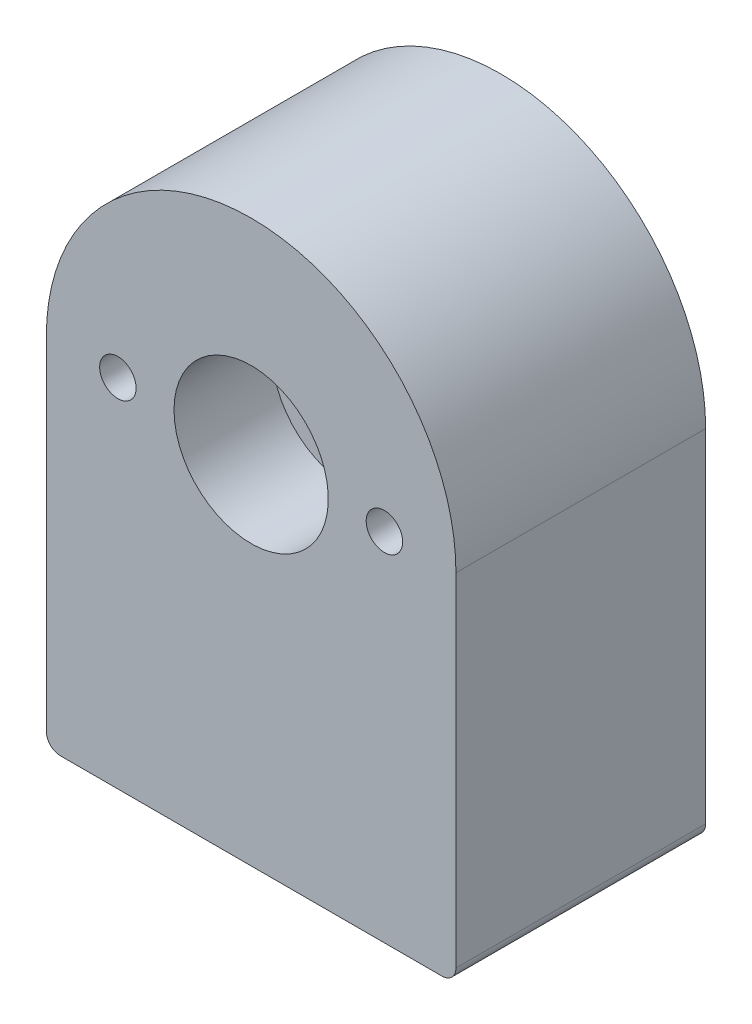
ISO-10303-21;
HEADER;
FILE_DESCRIPTION(('STEP AP214'),'2;1');
FILE_NAME('part.step','',(''),(''),'','','');
FILE_SCHEMA(('AUTOMOTIVE_DESIGN { 1 0 10303 214 1 1 1 1 }'));
ENDSEC;
DATA;
#1=APPLICATION_CONTEXT('core data for automotive mechanical design processes');
#2=APPLICATION_PROTOCOL_DEFINITION('international standard','automotive_design',2000,#1);
#3=PRODUCT_CONTEXT('',#1,'mechanical');
#4=PRODUCT('Part','Part','',(#3));
#5=PRODUCT_RELATED_PRODUCT_CATEGORY('part','',(#4));
#6=PRODUCT_DEFINITION_FORMATION('','',#4);
#7=PRODUCT_DEFINITION_CONTEXT('part definition',#1,'design');
#8=PRODUCT_DEFINITION('design','',#6,#7);
#9=PRODUCT_DEFINITION_SHAPE('','',#8);
#10=(LENGTH_UNIT() NAMED_UNIT(*) SI_UNIT(.MILLI.,.METRE.));
#11=(NAMED_UNIT(*) PLANE_ANGLE_UNIT() SI_UNIT($,.RADIAN.));
#12=(NAMED_UNIT(*) SI_UNIT($,.STERADIAN.) SOLID_ANGLE_UNIT());
#13=UNCERTAINTY_MEASURE_WITH_UNIT(LENGTH_MEASURE(1.E-05),#10,'distance_accuracy_value','');
#14=(GEOMETRIC_REPRESENTATION_CONTEXT(3) GLOBAL_UNCERTAINTY_ASSIGNED_CONTEXT((#13)) GLOBAL_UNIT_ASSIGNED_CONTEXT((#10,
#11,#12)) REPRESENTATION_CONTEXT('',''));
#15=CARTESIAN_POINT('',(0.,0.,0.));
#16=DIRECTION('',(0.,0.,1.));
#17=DIRECTION('',(1.,0.,0.));
#18=AXIS2_PLACEMENT_3D('',#15,#16,#17);
#19=CARTESIAN_POINT('',(0.,0.,1.));
#20=DIRECTION('',(0.,0.,1.));
#21=DIRECTION('',(1.,0.,0.));
#22=AXIS2_PLACEMENT_3D('',#19,#20,#21);
#23=PLANE('',#22);
#24=CARTESIAN_POINT('',(0.,0.,1.));
#25=DIRECTION('',(0.,0.,1.));
#26=DIRECTION('',(1.,0.,0.));
#27=AXIS2_PLACEMENT_3D('',#24,#25,#26);
#28=CIRCLE('',#27,3.);
#29=CARTESIAN_POINT('',(3.,0.,1.));
#30=VERTEX_POINT('',#29);
#31=EDGE_CURVE('E20',#30,#30,#28,.T.);
#32=ORIENTED_EDGE('',*,*,#31,.T.);
#33=EDGE_LOOP('',(#32));
#34=FACE_BOUND('',#33,.T.);
#35=ADVANCED_FACE('F17',(#34),#23,.T.);
#36=CARTESIAN_POINT('',(0.,0.,0.));
#37=DIRECTION('',(0.,0.,1.));
#38=DIRECTION('',(1.,0.,0.));
#39=AXIS2_PLACEMENT_3D('',#36,#37,#38);
#40=CYLINDRICAL_SURFACE('',#39,3.);
#41=CARTESIAN_POINT('',(0.,0.,10.8));
#42=DIRECTION('',(0.,0.,1.));
#43=DIRECTION('',(1.,0.,0.));
#44=AXIS2_PLACEMENT_3D('',#41,#42,#43);
#45=CIRCLE('',#44,3.);
#46=CARTESIAN_POINT('',(3.,0.,10.8));
#47=VERTEX_POINT('',#46);
#48=EDGE_CURVE('E88',#47,#47,#45,.T.);
#49=ORIENTED_EDGE('',*,*,#48,.T.);
#50=EDGE_LOOP('',(#49));
#51=FACE_BOUND('',#50,.T.);
#52=ORIENTED_EDGE('',*,*,#31,.F.);
#53=EDGE_LOOP('',(#52));
#54=FACE_BOUND('',#53,.T.);
#55=ADVANCED_FACE('F128',(#51,#54),#40,.F.);
#56=CARTESIAN_POINT('',(9.5,0.,9.80000000066639));
#57=DIRECTION('',(0.,0.,1.));
#58=DIRECTION('',(1.,0.,0.));
#59=AXIS2_PLACEMENT_3D('',#56,#57,#58);
#60=CONICAL_SURFACE('',#59,1.29999999933534,1.02974425721494);
#61=CARTESIAN_POINT('',(9.49999999977535,0.,9.01888119409477));
#62=VERTEX_POINT('',#61);
#63=VERTEX_LOOP('',#62);
#64=FACE_BOUND('',#63,.T.);
#65=CARTESIAN_POINT('',(9.5,0.,9.8));
#66=DIRECTION('',(0.,0.,1.));
#67=DIRECTION('',(1.,0.,0.));
#68=AXIS2_PLACEMENT_3D('',#65,#66,#67);
#69=CIRCLE('',#68,1.3);
#70=CARTESIAN_POINT('',(10.8,0.,9.8));
#71=VERTEX_POINT('',#70);
#72=EDGE_CURVE('E83',#71,#71,#69,.T.);
#73=ORIENTED_EDGE('',*,*,#72,.T.);
#74=EDGE_LOOP('',(#73));
#75=FACE_BOUND('',#74,.T.);
#76=ADVANCED_FACE('F76',(#64,#75),#60,.F.);
#77=CARTESIAN_POINT('',(-9.5,0.,9.80000000060954));
#78=DIRECTION('',(0.,0.,1.));
#79=DIRECTION('',(1.,0.,0.));
#80=AXIS2_PLACEMENT_3D('',#77,#78,#79);
#81=CONICAL_SURFACE('',#80,1.29999999927304,1.02974425724336);
#82=CARTESIAN_POINT('',(-9.50000000017326,0.,9.01888119409477));
#83=VERTEX_POINT('',#82);
#84=VERTEX_LOOP('',#83);
#85=FACE_BOUND('',#84,.T.);
#86=CARTESIAN_POINT('',(-9.5,0.,9.8));
#87=DIRECTION('',(0.,0.,1.));
#88=DIRECTION('',(1.,0.,0.));
#89=AXIS2_PLACEMENT_3D('',#86,#87,#88);
#90=CIRCLE('',#89,1.3);
#91=CARTESIAN_POINT('',(-8.2,0.,9.8));
#92=VERTEX_POINT('',#91);
#93=EDGE_CURVE('E80',#92,#92,#90,.T.);
#94=ORIENTED_EDGE('',*,*,#93,.T.);
#95=EDGE_LOOP('',(#94));
#96=FACE_BOUND('',#95,.T.);
#97=ADVANCED_FACE('F72',(#85,#96),#81,.F.);
#98=CARTESIAN_POINT('',(0.,0.,10.8));
#99=DIRECTION('',(0.,0.,-1.));
#100=DIRECTION('',(-1.,0.,0.));
#101=AXIS2_PLACEMENT_3D('',#98,#99,#100);
#102=PLANE('',#101);
#103=ORIENTED_EDGE('',*,*,#48,.F.);
#104=EDGE_LOOP('',(#103));
#105=FACE_BOUND('',#104,.T.);
#106=CARTESIAN_POINT('',(0.,0.,10.8));
#107=DIRECTION('',(0.,0.,-1.));
#108=DIRECTION('',(-1.,0.,0.));
#109=AXIS2_PLACEMENT_3D('',#106,#107,#108);
#110=CIRCLE('',#109,5.5);
#111=CARTESIAN_POINT('',(-5.5,0.,10.8));
#112=VERTEX_POINT('',#111);
#113=EDGE_CURVE('E82',#112,#112,#110,.F.);
#114=ORIENTED_EDGE('',*,*,#113,.T.);
#115=EDGE_LOOP('',(#114));
#116=FACE_BOUND('',#115,.T.);
#117=ADVANCED_FACE('F75',(#105,#116),#102,.F.);
#118=CARTESIAN_POINT('',(9.5,0.,13.8));
#119=DIRECTION('',(0.,0.,1.));
#120=DIRECTION('',(1.,0.,0.));
#121=AXIS2_PLACEMENT_3D('',#118,#119,#120);
#122=CYLINDRICAL_SURFACE('',#121,1.3);
#123=ORIENTED_EDGE('',*,*,#72,.F.);
#124=EDGE_LOOP('',(#123));
#125=FACE_BOUND('',#124,.T.);
#126=CARTESIAN_POINT('',(9.5,0.,17.8));
#127=DIRECTION('',(0.,0.,1.));
#128=DIRECTION('',(1.,0.,0.));
#129=AXIS2_PLACEMENT_3D('',#126,#127,#128);
#130=CIRCLE('',#129,1.3);
#131=CARTESIAN_POINT('',(10.8,0.,17.8));
#132=VERTEX_POINT('',#131);
#133=EDGE_CURVE('E116',#132,#132,#130,.F.);
#134=ORIENTED_EDGE('',*,*,#133,.F.);
#135=EDGE_LOOP('',(#134));
#136=FACE_BOUND('',#135,.T.);
#137=ADVANCED_FACE('F178',(#125,#136),#122,.F.);
#138=CARTESIAN_POINT('',(-9.5,0.,13.8));
#139=DIRECTION('',(0.,0.,1.));
#140=DIRECTION('',(1.,0.,0.));
#141=AXIS2_PLACEMENT_3D('',#138,#139,#140);
#142=CYLINDRICAL_SURFACE('',#141,1.3);
#143=ORIENTED_EDGE('',*,*,#93,.F.);
#144=EDGE_LOOP('',(#143));
#145=FACE_BOUND('',#144,.T.);
#146=CARTESIAN_POINT('',(-9.5,0.,17.8));
#147=DIRECTION('',(0.,0.,1.));
#148=DIRECTION('',(1.,0.,0.));
#149=AXIS2_PLACEMENT_3D('',#146,#147,#148);
#150=CIRCLE('',#149,1.3);
#151=CARTESIAN_POINT('',(-8.2,0.,17.8));
#152=VERTEX_POINT('',#151);
#153=EDGE_CURVE('E113',#152,#152,#150,.F.);
#154=ORIENTED_EDGE('',*,*,#153,.F.);
#155=EDGE_LOOP('',(#154));
#156=FACE_BOUND('',#155,.T.);
#157=ADVANCED_FACE('F174',(#145,#156),#142,.F.);
#158=CARTESIAN_POINT('',(0.,0.,17.8));
#159=DIRECTION('',(0.,0.,-1.));
#160=DIRECTION('',(-1.,0.,0.));
#161=AXIS2_PLACEMENT_3D('',#158,#159,#160);
#162=CYLINDRICAL_SURFACE('',#161,5.5);
#163=CARTESIAN_POINT('',(0.,0.,17.8));
#164=DIRECTION('',(0.,0.,-1.));
#165=DIRECTION('',(-1.,0.,0.));
#166=AXIS2_PLACEMENT_3D('',#163,#164,#165);
#167=CIRCLE('',#166,5.5);
#168=CARTESIAN_POINT('',(-5.5,0.,17.8));
#169=VERTEX_POINT('',#168);
#170=EDGE_CURVE('E110',#169,#169,#167,.T.);
#171=ORIENTED_EDGE('',*,*,#170,.F.);
#172=EDGE_LOOP('',(#171));
#173=FACE_BOUND('',#172,.T.);
#174=ORIENTED_EDGE('',*,*,#113,.F.);
#175=EDGE_LOOP('',(#174));
#176=FACE_BOUND('',#175,.T.);
#177=ADVANCED_FACE('F170',(#173,#176),#162,.F.);
#178=CARTESIAN_POINT('',(13.6,-24.4,0.));
#179=DIRECTION('',(0.,0.,1.));
#180=DIRECTION('',(1.,0.,0.));
#181=AXIS2_PLACEMENT_3D('',#178,#179,#180);
#182=CYLINDRICAL_SURFACE('',#181,1.);
#183=CARTESIAN_POINT('',(13.6,-24.4,0.));
#184=DIRECTION('',(0.,0.,1.));
#185=DIRECTION('',(1.,0.,0.));
#186=AXIS2_PLACEMENT_3D('',#183,#184,#185);
#187=CIRCLE('',#186,1.);
#188=CARTESIAN_POINT('',(13.6,-25.4,0.));
#189=VERTEX_POINT('',#188);
#190=CARTESIAN_POINT('',(14.6,-24.4,0.));
#191=VERTEX_POINT('',#190);
#192=EDGE_CURVE('E34',#189,#191,#187,.T.);
#193=ORIENTED_EDGE('',*,*,#192,.T.);
#194=DIRECTION('',(0.,0.,-1.));
#195=VECTOR('',#194,1.);
#196=CARTESIAN_POINT('',(14.6,-24.4,0.));
#197=LINE('',#196,#195);
#198=CARTESIAN_POINT('',(14.6,-24.4,17.8));
#199=VERTEX_POINT('',#198);
#200=EDGE_CURVE('E107',#199,#191,#197,.T.);
#201=ORIENTED_EDGE('',*,*,#200,.F.);
#202=CARTESIAN_POINT('',(13.6,-24.4,17.8));
#203=DIRECTION('',(0.,0.,1.));
#204=DIRECTION('',(1.,0.,0.));
#205=AXIS2_PLACEMENT_3D('',#202,#203,#204);
#206=CIRCLE('',#205,1.);
#207=CARTESIAN_POINT('',(13.6,-25.4,17.8));
#208=VERTEX_POINT('',#207);
#209=EDGE_CURVE('E119',#208,#199,#206,.T.);
#210=ORIENTED_EDGE('',*,*,#209,.F.);
#211=DIRECTION('',(0.,0.,-1.));
#212=VECTOR('',#211,1.);
#213=CARTESIAN_POINT('',(13.6,-25.4,0.));
#214=LINE('',#213,#212);
#215=EDGE_CURVE('E305',#189,#208,#214,.F.);
#216=ORIENTED_EDGE('',*,*,#215,.F.);
#217=EDGE_LOOP('',(#193,#201,#210,#216));
#218=FACE_BOUND('',#217,.T.);
#219=ADVANCED_FACE('F166',(#218),#182,.T.);
#220=CARTESIAN_POINT('',(0.,-7.96449577354765,17.8));
#221=DIRECTION('',(0.,0.,1.));
#222=DIRECTION('',(1.,0.,0.));
#223=AXIS2_PLACEMENT_3D('',#220,#221,#222);
#224=PLANE('',#223);
#225=ORIENTED_EDGE('',*,*,#170,.T.);
#226=EDGE_LOOP('',(#225));
#227=FACE_BOUND('',#226,.T.);
#228=ORIENTED_EDGE('',*,*,#153,.T.);
#229=EDGE_LOOP('',(#228));
#230=FACE_BOUND('',#229,.T.);
#231=ORIENTED_EDGE('',*,*,#133,.T.);
#232=EDGE_LOOP('',(#231));
#233=FACE_BOUND('',#232,.T.);
#234=CARTESIAN_POINT('',(-13.6,-24.4,17.8));
#235=DIRECTION('',(0.,0.,1.));
#236=DIRECTION('',(1.,0.,0.));
#237=AXIS2_PLACEMENT_3D('',#234,#235,#236);
#238=CIRCLE('',#237,1.);
#239=CARTESIAN_POINT('',(-13.6,-25.4,17.8));
#240=VERTEX_POINT('',#239);
#241=CARTESIAN_POINT('',(-14.6,-24.4,17.8));
#242=VERTEX_POINT('',#241);
#243=EDGE_CURVE('E108',#240,#242,#238,.F.);
#244=ORIENTED_EDGE('',*,*,#243,.F.);
#245=DIRECTION('',(1.,0.,0.));
#246=VECTOR('',#245,1.);
#247=CARTESIAN_POINT('',(14.6,-25.4,17.8));
#248=LINE('',#247,#246);
#249=EDGE_CURVE('E295',#208,#240,#248,.F.);
#250=ORIENTED_EDGE('',*,*,#249,.F.);
#251=ORIENTED_EDGE('',*,*,#209,.T.);
#252=DIRECTION('',(0.,1.,0.));
#253=VECTOR('',#252,1.);
#254=CARTESIAN_POINT('',(14.6,0.,17.8));
#255=LINE('',#254,#253);
#256=CARTESIAN_POINT('',(14.6,0.,17.8));
#257=VERTEX_POINT('',#256);
#258=EDGE_CURVE('E92',#257,#199,#255,.F.);
#259=ORIENTED_EDGE('',*,*,#258,.F.);
#260=CARTESIAN_POINT('',(0.,0.,17.8));
#261=DIRECTION('',(0.,0.,1.));
#262=DIRECTION('',(1.,0.,0.));
#263=AXIS2_PLACEMENT_3D('',#260,#261,#262);
#264=CIRCLE('',#263,14.6);
#265=CARTESIAN_POINT('',(-14.6,0.,17.8));
#266=VERTEX_POINT('',#265);
#267=EDGE_CURVE('E102',#266,#257,#264,.F.);
#268=ORIENTED_EDGE('',*,*,#267,.F.);
#269=DIRECTION('',(0.,1.,0.));
#270=VECTOR('',#269,1.);
#271=CARTESIAN_POINT('',(-14.6,-25.4,17.8));
#272=LINE('',#271,#270);
#273=EDGE_CURVE('E297',#242,#266,#272,.T.);
#274=ORIENTED_EDGE('',*,*,#273,.F.);
#275=EDGE_LOOP('',(#244,#250,#251,#259,#268,#274));
#276=FACE_BOUND('',#275,.T.);
#277=ADVANCED_FACE('F162',(#227,#230,#233,#276),#224,.T.);
#278=CARTESIAN_POINT('',(-13.6,-24.4,0.));
#279=DIRECTION('',(0.,0.,1.));
#280=DIRECTION('',(1.,0.,0.));
#281=AXIS2_PLACEMENT_3D('',#278,#279,#280);
#282=CYLINDRICAL_SURFACE('',#281,1.);
#283=CARTESIAN_POINT('',(-13.6,-24.4,0.));
#284=DIRECTION('',(0.,0.,1.));
#285=DIRECTION('',(1.,0.,0.));
#286=AXIS2_PLACEMENT_3D('',#283,#284,#285);
#287=CIRCLE('',#286,1.);
#288=CARTESIAN_POINT('',(-14.6,-24.4,0.));
#289=VERTEX_POINT('',#288);
#290=CARTESIAN_POINT('',(-13.6,-25.4,0.));
#291=VERTEX_POINT('',#290);
#292=EDGE_CURVE('E105',#289,#291,#287,.T.);
#293=ORIENTED_EDGE('',*,*,#292,.T.);
#294=DIRECTION('',(0.,0.,-1.));
#295=VECTOR('',#294,1.);
#296=CARTESIAN_POINT('',(-13.6,-25.4,0.));
#297=LINE('',#296,#295);
#298=EDGE_CURVE('E301',#240,#291,#297,.T.);
#299=ORIENTED_EDGE('',*,*,#298,.F.);
#300=ORIENTED_EDGE('',*,*,#243,.T.);
#301=DIRECTION('',(0.,0.,1.));
#302=VECTOR('',#301,1.);
#303=CARTESIAN_POINT('',(-14.6,-24.4,0.));
#304=LINE('',#303,#302);
#305=EDGE_CURVE('E312',#289,#242,#304,.T.);
#306=ORIENTED_EDGE('',*,*,#305,.F.);
#307=EDGE_LOOP('',(#293,#299,#300,#306));
#308=FACE_BOUND('',#307,.T.);
#309=ADVANCED_FACE('F158',(#308),#282,.T.);
#310=CARTESIAN_POINT('',(14.6,0.,0.));
#311=DIRECTION('',(1.,0.,0.));
#312=DIRECTION('',(0.,0.,-1.));
#313=AXIS2_PLACEMENT_3D('',#310,#311,#312);
#314=PLANE('',#313);
#315=DIRECTION('',(0.,0.,1.));
#316=VECTOR('',#315,1.);
#317=CARTESIAN_POINT('',(14.6,0.,0.));
#318=LINE('',#317,#316);
#319=CARTESIAN_POINT('',(14.6,0.,0.));
#320=VERTEX_POINT('',#319);
#321=EDGE_CURVE('E104',#257,#320,#318,.F.);
#322=ORIENTED_EDGE('',*,*,#321,.F.);
#323=ORIENTED_EDGE('',*,*,#258,.T.);
#324=ORIENTED_EDGE('',*,*,#200,.T.);
#325=DIRECTION('',(0.,1.,0.));
#326=VECTOR('',#325,1.);
#327=CARTESIAN_POINT('',(14.6,-7.96449577354765,0.));
#328=LINE('',#327,#326);
#329=EDGE_CURVE('E101',#191,#320,#328,.T.);
#330=ORIENTED_EDGE('',*,*,#329,.T.);
#331=EDGE_LOOP('',(#322,#323,#324,#330));
#332=FACE_BOUND('',#331,.T.);
#333=ADVANCED_FACE('F154',(#332),#314,.T.);
#334=CARTESIAN_POINT('',(0.,0.,0.));
#335=DIRECTION('',(0.,0.,1.));
#336=DIRECTION('',(1.,0.,0.));
#337=AXIS2_PLACEMENT_3D('',#334,#335,#336);
#338=CYLINDRICAL_SURFACE('',#337,14.6);
#339=CARTESIAN_POINT('',(0.,0.,0.));
#340=DIRECTION('',(0.,0.,1.));
#341=DIRECTION('',(1.,0.,0.));
#342=AXIS2_PLACEMENT_3D('',#339,#340,#341);
#343=CIRCLE('',#342,14.6);
#344=CARTESIAN_POINT('',(-14.6,0.,0.));
#345=VERTEX_POINT('',#344);
#346=EDGE_CURVE('E98',#320,#345,#343,.T.);
#347=ORIENTED_EDGE('',*,*,#346,.T.);
#348=DIRECTION('',(0.,0.,1.));
#349=VECTOR('',#348,1.);
#350=CARTESIAN_POINT('',(-14.6,0.,0.));
#351=LINE('',#350,#349);
#352=EDGE_CURVE('E310',#266,#345,#351,.F.);
#353=ORIENTED_EDGE('',*,*,#352,.F.);
#354=ORIENTED_EDGE('',*,*,#267,.T.);
#355=ORIENTED_EDGE('',*,*,#321,.T.);
#356=EDGE_LOOP('',(#347,#353,#354,#355));
#357=FACE_BOUND('',#356,.T.);
#358=ADVANCED_FACE('F150',(#357),#338,.T.);
#359=CARTESIAN_POINT('',(-14.6,-25.4,0.));
#360=DIRECTION('',(-1.,0.,0.));
#361=DIRECTION('',(0.,0.,1.));
#362=AXIS2_PLACEMENT_3D('',#359,#360,#361);
#363=PLANE('',#362);
#364=ORIENTED_EDGE('',*,*,#352,.T.);
#365=DIRECTION('',(0.,1.,0.));
#366=VECTOR('',#365,1.);
#367=CARTESIAN_POINT('',(-14.6,-7.96449577354765,0.));
#368=LINE('',#367,#366);
#369=EDGE_CURVE('E26',#345,#289,#368,.F.);
#370=ORIENTED_EDGE('',*,*,#369,.T.);
#371=ORIENTED_EDGE('',*,*,#305,.T.);
#372=ORIENTED_EDGE('',*,*,#273,.T.);
#373=EDGE_LOOP('',(#364,#370,#371,#372));
#374=FACE_BOUND('',#373,.T.);
#375=ADVANCED_FACE('F144',(#374),#363,.T.);
#376=CARTESIAN_POINT('',(14.6,-25.4,0.));
#377=DIRECTION('',(0.,-1.,0.));
#378=DIRECTION('',(0.,0.,-1.));
#379=AXIS2_PLACEMENT_3D('',#376,#377,#378);
#380=PLANE('',#379);
#381=ORIENTED_EDGE('',*,*,#298,.T.);
#382=DIRECTION('',(1.,0.,0.));
#383=VECTOR('',#382,1.);
#384=CARTESIAN_POINT('',(0.,-25.4,0.));
#385=LINE('',#384,#383);
#386=EDGE_CURVE('E11',#291,#189,#385,.T.);
#387=ORIENTED_EDGE('',*,*,#386,.T.);
#388=ORIENTED_EDGE('',*,*,#215,.T.);
#389=ORIENTED_EDGE('',*,*,#249,.T.);
#390=EDGE_LOOP('',(#381,#387,#388,#389));
#391=FACE_BOUND('',#390,.T.);
#392=ADVANCED_FACE('F139',(#391),#380,.T.);
#393=CARTESIAN_POINT('',(0.,-7.96449577354765,0.));
#394=DIRECTION('',(0.,0.,1.));
#395=DIRECTION('',(1.,0.,0.));
#396=AXIS2_PLACEMENT_3D('',#393,#394,#395);
#397=PLANE('',#396);
#398=ORIENTED_EDGE('',*,*,#386,.F.);
#399=ORIENTED_EDGE('',*,*,#292,.F.);
#400=ORIENTED_EDGE('',*,*,#369,.F.);
#401=ORIENTED_EDGE('',*,*,#346,.F.);
#402=ORIENTED_EDGE('',*,*,#329,.F.);
#403=ORIENTED_EDGE('',*,*,#192,.F.);
#404=EDGE_LOOP('',(#398,#399,#400,#401,#402,#403));
#405=FACE_BOUND('',#404,.T.);
#406=ADVANCED_FACE('F137',(#405),#397,.F.);
#407=CLOSED_SHELL('',(#35,#55,#76,#97,#117,#137,#157,#177,#219,#277,#309,#333,#358,#375,#392,#406));
#408=MANIFOLD_SOLID_BREP('B1',#407);
#409=ADVANCED_BREP_SHAPE_REPRESENTATION('',(#18,#408),#14);
#410=SHAPE_DEFINITION_REPRESENTATION(#9,#409);
ENDSEC;
END-ISO-10303-21;
